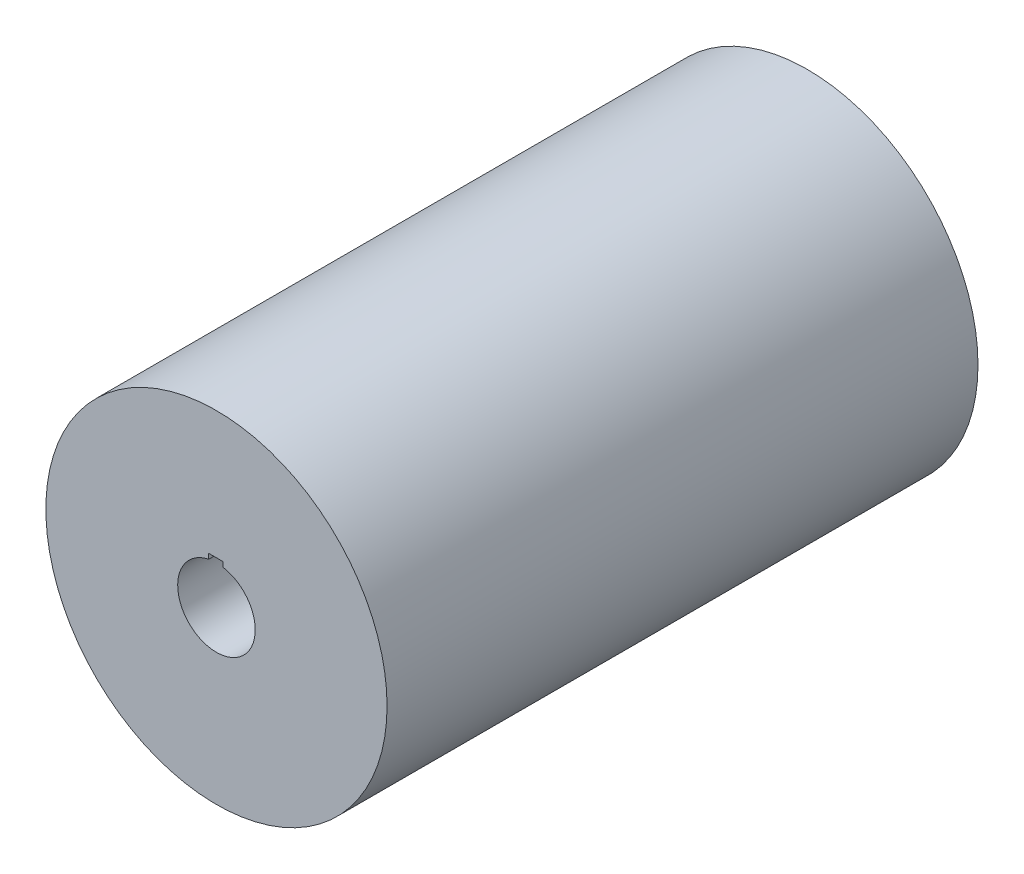
ISO-10303-21;
HEADER;
FILE_DESCRIPTION(('STEP AP214'),'2;1');
FILE_NAME('part.step','',(''),(''),'','','');
FILE_SCHEMA(('AUTOMOTIVE_DESIGN { 1 0 10303 214 1 1 1 1 }'));
ENDSEC;
DATA;
#1=APPLICATION_CONTEXT('core data for automotive mechanical design processes');
#2=APPLICATION_PROTOCOL_DEFINITION('international standard','automotive_design',2000,#1);
#3=PRODUCT_CONTEXT('',#1,'mechanical');
#4=PRODUCT('Part','Part','',(#3));
#5=PRODUCT_RELATED_PRODUCT_CATEGORY('part','',(#4));
#6=PRODUCT_DEFINITION_FORMATION('','',#4);
#7=PRODUCT_DEFINITION_CONTEXT('part definition',#1,'design');
#8=PRODUCT_DEFINITION('design','',#6,#7);
#9=PRODUCT_DEFINITION_SHAPE('','',#8);
#10=(LENGTH_UNIT() NAMED_UNIT(*) SI_UNIT(.MILLI.,.METRE.));
#11=(NAMED_UNIT(*) PLANE_ANGLE_UNIT() SI_UNIT($,.RADIAN.));
#12=(NAMED_UNIT(*) SI_UNIT($,.STERADIAN.) SOLID_ANGLE_UNIT());
#13=UNCERTAINTY_MEASURE_WITH_UNIT(LENGTH_MEASURE(1.E-05),#10,'distance_accuracy_value','');
#14=(GEOMETRIC_REPRESENTATION_CONTEXT(3) GLOBAL_UNCERTAINTY_ASSIGNED_CONTEXT((#13)) GLOBAL_UNIT_ASSIGNED_CONTEXT((#10,
#11,#12)) REPRESENTATION_CONTEXT('',''));
#15=CARTESIAN_POINT('',(0.,0.,0.));
#16=DIRECTION('',(0.,0.,1.));
#17=DIRECTION('',(1.,0.,0.));
#18=AXIS2_PLACEMENT_3D('',#15,#16,#17);
#19=CARTESIAN_POINT('',(0.,0.,50.8));
#20=DIRECTION('',(0.,0.,-1.));
#21=DIRECTION('',(-1.,0.,0.));
#22=AXIS2_PLACEMENT_3D('',#19,#20,#21);
#23=CYLINDRICAL_SURFACE('',#22,11.);
#24=CARTESIAN_POINT('',(0.,0.,12.7));
#25=DIRECTION('',(0.,0.,1.));
#26=DIRECTION('',(1.,0.,0.));
#27=AXIS2_PLACEMENT_3D('',#24,#25,#26);
#28=CIRCLE('',#27,11.);
#29=CARTESIAN_POINT('',(11.,0.,12.7));
#30=VERTEX_POINT('',#29);
#31=EDGE_CURVE('E226',#30,#30,#28,.T.);
#32=ORIENTED_EDGE('',*,*,#31,.T.);
#33=EDGE_LOOP('',(#32));
#34=FACE_BOUND('',#33,.T.);
#35=CARTESIAN_POINT('',(0.,-11.,42.6815604588032));
#36=CARTESIAN_POINT('',(0.17447784882036,-10.9999980315971,42.6815575656811));
#37=CARTESIAN_POINT('',(0.348985296611114,-10.9958086419645,42.667130269524));
#38=CARTESIAN_POINT('',(0.692937523118161,-10.9795047089388,42.6099268589009));
#39=CARTESIAN_POINT('',(0.862380444771043,-10.9673872948852,42.5671404758121));
#40=CARTESIAN_POINT('',(1.19119170201237,-10.93655850108,42.4547524865095));
#41=CARTESIAN_POINT('',(1.35057388190038,-10.9178564263374,42.3851887074722));
#42=CARTESIAN_POINT('',(1.65541144724201,-10.8758135769035,42.2213705269558));
#43=CARTESIAN_POINT('',(1.8008652920113,-10.8524722899215,42.1271133983172));
#44=CARTESIAN_POINT('',(2.0776123663672,-10.80295251118,41.9139224262729));
#45=CARTESIAN_POINT('',(2.20847972910201,-10.7767191903409,41.7944485101898));
#46=CARTESIAN_POINT('',(2.44862695013,-10.7247076783817,41.5353675993764));
#47=CARTESIAN_POINT('',(2.55790349439264,-10.6989295576835,41.3957575195748));
#48=CARTESIAN_POINT('',(2.75394938582188,-10.650174042475,41.0968363136008));
#49=CARTESIAN_POINT('',(2.84020953762731,-10.6272651640779,40.9371790173192));
#50=CARTESIAN_POINT('',(2.98448667964161,-10.5876568016523,40.6048574751276));
#51=CARTESIAN_POINT('',(3.04250988628328,-10.5709559511025,40.4321961017717));
#52=CARTESIAN_POINT('',(3.12715034714241,-10.5462240912952,40.0835276400736));
#53=CARTESIAN_POINT('',(3.15454826954992,-10.5379780388904,39.907725710851));
#54=CARTESIAN_POINT('',(3.17959692368801,-10.5304486860519,39.5538421684694));
#55=CARTESIAN_POINT('',(3.17725426651472,-10.5311633937115,39.375761070744));
#56=CARTESIAN_POINT('',(3.14350374872841,-10.5412835501104,39.0286303058009));
#57=CARTESIAN_POINT('',(3.11306181582723,-10.550400162677,38.8594769289684));
#58=CARTESIAN_POINT('',(3.02553270427924,-10.5758313370651,38.5287878967923));
#59=CARTESIAN_POINT('',(2.96844307248755,-10.5921465615717,38.3672529442965));
#60=CARTESIAN_POINT('',(2.82850138546198,-10.6303753213086,38.0539690684149));
#61=CARTESIAN_POINT('',(2.74532719879953,-10.6523582097638,37.9023728618308));
#62=CARTESIAN_POINT('',(2.55580154530478,-10.6994106638876,37.6149600123187));
#63=CARTESIAN_POINT('',(2.44944482568637,-10.7244809285447,37.4791469563069));
#64=CARTESIAN_POINT('',(2.21172581350605,-10.7760657372918,37.2216623382329));
#65=CARTESIAN_POINT('',(2.07955843927191,-10.8025987253252,37.1007365535988));
#66=CARTESIAN_POINT('',(1.7964913509913,-10.853260482362,36.8825992768039));
#67=CARTESIAN_POINT('',(1.64559062670365,-10.8773891215785,36.7853890644016));
#68=CARTESIAN_POINT('',(1.32805611310651,-10.9207168861609,36.617034390285));
#69=CARTESIAN_POINT('',(1.16133605771218,-10.9398865748984,36.5460445563074));
#70=CARTESIAN_POINT('',(0.817643733250416,-10.970924432868,36.433326366705));
#71=CARTESIAN_POINT('',(0.640674116129169,-10.9827944816379,36.3915904782807));
#72=CARTESIAN_POINT('',(0.287854792866045,-10.9976029144195,36.3397814417952));
#73=CARTESIAN_POINT('',(0.112165415352634,-11.0008266125237,36.3286964718568));
#74=CARTESIAN_POINT('',(-0.238569352848221,-10.9988102491892,36.3356826769815));
#75=CARTESIAN_POINT('',(-0.413614819898147,-10.9935712260693,36.3537502752206));
#76=CARTESIAN_POINT('',(-0.754347232215775,-10.9754040798234,36.4177060260621));
#77=CARTESIAN_POINT('',(-0.920152754142821,-10.9626368464645,36.4630124285352));
#78=CARTESIAN_POINT('',(-1.241780904537,-10.9308791540561,36.5794684180375));
#79=CARTESIAN_POINT('',(-1.39760236606275,-10.9118879691288,36.6506210195234));
#80=CARTESIAN_POINT('',(-1.698636240984,-10.8691431894916,36.8185103029531));
#81=CARTESIAN_POINT('',(-1.84354059271255,-10.8452941833473,36.9157744256937));
#82=CARTESIAN_POINT('',(-2.11531962144669,-10.7955797782755,37.1324773283788));
#83=CARTESIAN_POINT('',(-2.24219010017519,-10.769713911987,37.2519212568937));
#84=CARTESIAN_POINT('',(-2.47868959766384,-10.7178013554388,37.5143386940007));
#85=CARTESIAN_POINT('',(-2.58760041901602,-10.6917775287883,37.6579653278818));
#86=CARTESIAN_POINT('',(-2.779812504026,-10.6434252712996,37.9620186172471));
#87=CARTESIAN_POINT('',(-2.86311462038128,-10.6210967174307,38.1224447131182));
#88=CARTESIAN_POINT('',(-3.00114332068901,-10.582923622818,38.4549053185694));
#89=CARTESIAN_POINT('',(-3.05601817781999,-10.567045532883,38.6268741993535));
#90=CARTESIAN_POINT('',(-3.13589248945074,-10.5436210190611,38.9781478928741));
#91=CARTESIAN_POINT('',(-3.16090123016605,-10.5360720054857,39.1574504074348));
#92=CARTESIAN_POINT('',(-3.17973495731541,-10.5304021562534,39.5108802626274));
#93=CARTESIAN_POINT('',(-3.1747245750257,-10.5319291848155,39.6849407438746));
#94=CARTESIAN_POINT('',(-3.13641460445321,-10.5434005221629,40.0296231559947));
#95=CARTESIAN_POINT('',(-3.10311599678252,-10.553344539173,40.2002452058512));
#96=CARTESIAN_POINT('',(-3.00990083329036,-10.5803022392745,40.5314589500593));
#97=CARTESIAN_POINT('',(-2.95027089422422,-10.5972396733982,40.6921379651415));
#98=CARTESIAN_POINT('',(-2.80630762342209,-10.6362669560965,41.0013381108017));
#99=CARTESIAN_POINT('',(-2.72196984550124,-10.6583577318709,41.149857047009));
#100=CARTESIAN_POINT('',(-2.5276231791783,-10.7061404454788,41.435980827675));
#101=CARTESIAN_POINT('',(-2.4168389036018,-10.731929292612,41.5730428377801));
#102=CARTESIAN_POINT('',(-2.17416738015881,-10.7837083063394,41.827008818594));
#103=CARTESIAN_POINT('',(-2.04227479339959,-10.8096985222787,41.9439076738836));
#104=CARTESIAN_POINT('',(-1.75693999431164,-10.8597726207822,42.1572863698102));
#105=CARTESIAN_POINT('',(-1.60302138924242,-10.883788195325,42.2531467560879));
#106=CARTESIAN_POINT('',(-1.28055928911018,-10.9264149803965,42.4174879712137));
#107=CARTESIAN_POINT('',(-1.11202361610921,-10.9450290585434,42.4859833352733));
#108=CARTESIAN_POINT('',(-0.787202865035639,-10.9728498912777,42.5865075411475));
#109=CARTESIAN_POINT('',(-0.632077060056496,-10.9829506569497,42.6220608624997));
#110=CARTESIAN_POINT('',(-0.317975335242661,-10.9965261441504,42.6695869881041));
#111=CARTESIAN_POINT('',(-0.15899995785191,-11.0000017937863,42.6815630952771));
#112=CARTESIAN_POINT('',(0.,-11.,42.6815604588032));
#113=B_SPLINE_CURVE_WITH_KNOTS('',3,(#35,#36,#37,#38,#39,#40,#41,#42,#43,#44,#45,#46,#47,#48,
#49,#50,#51,#52,#53,#54,#55,#56,#57,#58,#59,#60,#61,#62,#63,#64,#65,#66,#67,#68,#69,#70,#71,#72,
#73,#74,#75,#76,#77,#78,#79,#80,#81,#82,#83,#84,#85,#86,#87,#88,#89,#90,#91,#92,#93,#94,#95,#96,
#97,#98,#99,#100,#101,#102,#103,#104,#105,#106,#107,#108,#109,#110,#111,#112),.UNSPECIFIED.,.T.,
.F.,(4,2,2,2,2,2,2,2,2,2,2,2,2,2,2,2,2,2,2,2,2,2,2,2,2,2,2,2,2,2,2,2,2,2,2,2,2,2,4),(0.,
0.522849842782911,1.04588910926093,1.56819219820975,2.09055299519557,2.62550552412474,
3.16054010061979,3.70658003500084,4.25249970290628,4.78416127082409,5.31570465664107,
5.82963025664875,6.3436031771655,6.86419146209175,7.38489782672938,7.92565183110965,
8.46643500963484,9.01035823514409,9.55414135061991,10.0797461914809,10.6052865490665,
11.1199827539484,11.634739007424,12.1607976381826,12.6869785352694,13.2307502612654,
13.7745038792386,14.3153920400297,14.8561119796568,15.3759933923317,15.8958567840387,
16.4101958290127,16.9246274864016,17.4565514687622,17.9886102030832,18.5346936455598,
19.0804866433583,19.5570213557321,20.0334893058325),.UNSPECIFIED.);
#114=CARTESIAN_POINT('',(0.,-11.,42.6815604588032));
#115=VERTEX_POINT('',#114);
#116=EDGE_CURVE('E107',#115,#115,#113,.T.);
#117=ORIENTED_EDGE('',*,*,#116,.T.);
#118=EDGE_LOOP('',(#117));
#119=FACE_BOUND('',#118,.T.);
#120=CARTESIAN_POINT('',(0.,0.,50.8));
#121=DIRECTION('',(0.,0.,1.));
#122=DIRECTION('',(1.,0.,0.));
#123=AXIS2_PLACEMENT_3D('',#120,#121,#122);
#124=CIRCLE('',#123,11.);
#125=CARTESIAN_POINT('',(11.,0.,50.8));
#126=VERTEX_POINT('',#125);
#127=EDGE_CURVE('E185',#126,#126,#124,.T.);
#128=ORIENTED_EDGE('',*,*,#127,.F.);
#129=EDGE_LOOP('',(#128));
#130=FACE_BOUND('',#129,.T.);
#131=ADVANCED_FACE('F38',(#34,#119,#130),#23,.T.);
#132=CARTESIAN_POINT('',(0.,0.,50.8));
#133=DIRECTION('',(0.,0.,1.));
#134=DIRECTION('',(1.,0.,0.));
#135=AXIS2_PLACEMENT_3D('',#132,#133,#134);
#136=PLANE('',#135);
#137=DIRECTION('',(0.,-1.,0.));
#138=VECTOR('',#137,1.);
#139=CARTESIAN_POINT('',(-0.5,2.78020951222945,50.8));
#140=LINE('',#139,#138);
#141=CARTESIAN_POINT('',(-0.5,2.78020951222945,50.8));
#142=VERTEX_POINT('',#141);
#143=CARTESIAN_POINT('',(-0.5,2.44948974278318,50.8));
#144=VERTEX_POINT('',#143);
#145=EDGE_CURVE('E146',#142,#144,#140,.T.);
#146=ORIENTED_EDGE('',*,*,#145,.F.);
#147=DIRECTION('',(1.,0.,0.));
#148=VECTOR('',#147,1.);
#149=CARTESIAN_POINT('',(-0.5,2.78020951222945,50.8));
#150=LINE('',#149,#148);
#151=CARTESIAN_POINT('',(0.429150012935397,2.78020951222945,50.8));
#152=VERTEX_POINT('',#151);
#153=EDGE_CURVE('E152',#142,#152,#150,.T.);
#154=ORIENTED_EDGE('',*,*,#153,.T.);
#155=DIRECTION('',(0.,-1.,0.));
#156=VECTOR('',#155,1.);
#157=CARTESIAN_POINT('',(0.429150012935397,2.78020951222945,50.8));
#158=LINE('',#157,#156);
#159=CARTESIAN_POINT('',(0.429150012935397,2.46289063224447,50.8));
#160=VERTEX_POINT('',#159);
#161=EDGE_CURVE('E161',#152,#160,#158,.T.);
#162=ORIENTED_EDGE('',*,*,#161,.T.);
#163=CARTESIAN_POINT('',(0.,0.,50.8));
#164=DIRECTION('',(0.,0.,1.));
#165=DIRECTION('',(1.,0.,0.));
#166=AXIS2_PLACEMENT_3D('',#163,#164,#165);
#167=CIRCLE('',#166,2.5);
#168=EDGE_CURVE('E171',#144,#160,#167,.T.);
#169=ORIENTED_EDGE('',*,*,#168,.F.);
#170=EDGE_LOOP('',(#146,#154,#162,#169));
#171=FACE_BOUND('',#170,.T.);
#172=ORIENTED_EDGE('',*,*,#127,.T.);
#173=EDGE_LOOP('',(#172));
#174=FACE_BOUND('',#173,.T.);
#175=ADVANCED_FACE('F200',(#171,#174),#136,.T.);
#176=CARTESIAN_POINT('',(0.,0.,25.4));
#177=DIRECTION('',(0.,0.,-1.));
#178=DIRECTION('',(-1.,0.,0.));
#179=AXIS2_PLACEMENT_3D('',#176,#177,#178);
#180=CYLINDRICAL_SURFACE('',#179,5.);
#181=CARTESIAN_POINT('',(0.,0.,12.7));
#182=DIRECTION('',(0.,0.,1.));
#183=DIRECTION('',(1.,0.,0.));
#184=AXIS2_PLACEMENT_3D('',#181,#182,#183);
#185=CIRCLE('',#184,5.);
#186=CARTESIAN_POINT('',(5.,0.,12.7));
#187=VERTEX_POINT('',#186);
#188=EDGE_CURVE('E42',#187,#187,#185,.T.);
#189=ORIENTED_EDGE('',*,*,#188,.F.);
#190=EDGE_LOOP('',(#189));
#191=FACE_BOUND('',#190,.T.);
#192=CARTESIAN_POINT('',(0.,0.,25.4));
#193=DIRECTION('',(0.,0.,1.));
#194=DIRECTION('',(1.,0.,0.));
#195=AXIS2_PLACEMENT_3D('',#192,#193,#194);
#196=CIRCLE('',#195,5.);
#197=CARTESIAN_POINT('',(5.,0.,25.4));
#198=VERTEX_POINT('',#197);
#199=EDGE_CURVE('E178',#198,#198,#196,.T.);
#200=ORIENTED_EDGE('',*,*,#199,.T.);
#201=EDGE_LOOP('',(#200));
#202=FACE_BOUND('',#201,.T.);
#203=ADVANCED_FACE('F222',(#191,#202),#180,.F.);
#204=CARTESIAN_POINT('',(0.,0.,25.4));
#205=DIRECTION('',(0.,0.,1.));
#206=DIRECTION('',(1.,0.,0.));
#207=AXIS2_PLACEMENT_3D('',#204,#205,#206);
#208=PLANE('',#207);
#209=DIRECTION('',(1.,0.,0.));
#210=VECTOR('',#209,1.);
#211=CARTESIAN_POINT('',(-0.5,2.78020951222945,25.4));
#212=LINE('',#211,#210);
#213=CARTESIAN_POINT('',(-0.5,2.78020951222945,25.4));
#214=VERTEX_POINT('',#213);
#215=CARTESIAN_POINT('',(0.429150012935397,2.78020951222945,25.4));
#216=VERTEX_POINT('',#215);
#217=EDGE_CURVE('E155',#214,#216,#212,.T.);
#218=ORIENTED_EDGE('',*,*,#217,.F.);
#219=DIRECTION('',(0.,-1.,0.));
#220=VECTOR('',#219,1.);
#221=CARTESIAN_POINT('',(-0.5,2.78020951222945,25.4));
#222=LINE('',#221,#220);
#223=CARTESIAN_POINT('',(-0.5,2.44948974278318,25.4));
#224=VERTEX_POINT('',#223);
#225=EDGE_CURVE('E148',#214,#224,#222,.T.);
#226=ORIENTED_EDGE('',*,*,#225,.T.);
#227=CARTESIAN_POINT('',(0.,0.,25.4));
#228=DIRECTION('',(0.,0.,1.));
#229=DIRECTION('',(1.,0.,0.));
#230=AXIS2_PLACEMENT_3D('',#227,#228,#229);
#231=CIRCLE('',#230,2.5);
#232=CARTESIAN_POINT('',(0.429150012935397,2.46289063224447,25.4));
#233=VERTEX_POINT('',#232);
#234=EDGE_CURVE('E174',#224,#233,#231,.T.);
#235=ORIENTED_EDGE('',*,*,#234,.T.);
#236=DIRECTION('',(0.,-1.,0.));
#237=VECTOR('',#236,1.);
#238=CARTESIAN_POINT('',(0.429150012935397,2.78020951222945,25.4));
#239=LINE('',#238,#237);
#240=EDGE_CURVE('E62',#216,#233,#239,.T.);
#241=ORIENTED_EDGE('',*,*,#240,.F.);
#242=EDGE_LOOP('',(#218,#226,#235,#241));
#243=FACE_BOUND('',#242,.T.);
#244=ORIENTED_EDGE('',*,*,#199,.F.);
#245=EDGE_LOOP('',(#244));
#246=FACE_BOUND('',#245,.T.);
#247=ADVANCED_FACE('F207',(#243,#246),#208,.F.);
#248=CARTESIAN_POINT('',(0.,0.,25.4));
#249=DIRECTION('',(0.,0.,1.));
#250=DIRECTION('',(1.,0.,0.));
#251=AXIS2_PLACEMENT_3D('',#248,#249,#250);
#252=CYLINDRICAL_SURFACE('',#251,2.5);
#253=CARTESIAN_POINT('',(2.5,0.,41.4637587114082));
#254=CARTESIAN_POINT('',(2.50001095177646,-0.0483908730512587,41.463729243075));
#255=CARTESIAN_POINT('',(2.4985954686324,-0.0967635234678165,41.4655526142861));
#256=CARTESIAN_POINT('',(2.49300031524189,-0.193014985957058,41.4726761335237));
#257=CARTESIAN_POINT('',(2.48882512774837,-0.240894471227123,41.4779706430593));
#258=CARTESIAN_POINT('',(2.47786945737588,-0.335252351070256,41.4917201334698));
#259=CARTESIAN_POINT('',(2.47112308335948,-0.381740839970777,41.5001336992607));
#260=CARTESIAN_POINT('',(2.45515609375413,-0.473696750606339,41.519765660189));
#261=CARTESIAN_POINT('',(2.44593430191665,-0.519163675763782,41.530985388562));
#262=CARTESIAN_POINT('',(2.4076592356589,-0.684424677517972,41.5767492119193));
#263=CARTESIAN_POINT('',(2.37134907026899,-0.800534718171201,41.6187699141995));
#264=CARTESIAN_POINT('',(2.28409602761612,-1.02342598835804,41.7128381171083));
#265=CARTESIAN_POINT('',(2.23305068668041,-1.13013481765496,41.7649549581354));
#266=CARTESIAN_POINT('',(2.13696989097109,-1.29977566299991,41.8553448340557));
#267=CARTESIAN_POINT('',(2.09559676941051,-1.3654493441476,41.8924462423511));
#268=CARTESIAN_POINT('',(2.00714738579708,-1.49243280934942,41.9673220116541));
#269=CARTESIAN_POINT('',(1.96006924588934,-1.55374114591402,42.0050965907328));
#270=CARTESIAN_POINT('',(1.81060838932857,-1.73075502377953,42.1176526078712));
#271=CARTESIAN_POINT('',(1.69977934027794,-1.83993624018912,42.1918847602206));
#272=CARTESIAN_POINT('',(1.47979164567611,-2.01898032492359,42.3179192827941));
#273=CARTESIAN_POINT('',(1.37438189365787,-2.09236846374418,42.3712940443104));
#274=CARTESIAN_POINT('',(1.15018742086861,-2.22348022807807,42.4684082011757));
#275=CARTESIAN_POINT('',(1.03142115877075,-2.28122510506922,42.5121606531279));
#276=CARTESIAN_POINT('',(0.802232099896731,-2.37045818864128,42.5804857571437));
#277=CARTESIAN_POINT('',(0.693444886276972,-2.40465036620803,42.6069945485852));
#278=CARTESIAN_POINT('',(0.47013708051634,-2.45807284580685,42.6486080102013));
#279=CARTESIAN_POINT('',(0.355619737008753,-2.4773115255171,42.6637190658024));
#280=CARTESIAN_POINT('',(0.123659893884932,-2.49966457877044,42.6812887062803));
#281=CARTESIAN_POINT('',(0.00620917570775319,-2.50272692969069,42.6837064697309));
#282=CARTESIAN_POINT('',(-0.227504946230108,-2.49237348795664,42.6755572277553));
#283=CARTESIAN_POINT('',(-0.343768264020442,-2.47895651057274,42.6649892887629));
#284=CARTESIAN_POINT('',(-0.565850143703403,-2.43760998350453,42.6326463540632));
#285=CARTESIAN_POINT('',(-0.671900194734805,-2.41044080843065,42.6114590620313));
#286=CARTESIAN_POINT('',(-0.877480569931715,-2.34344384024387,42.5597394170646));
#287=CARTESIAN_POINT('',(-0.977009037725033,-2.30361246154535,42.5292044172085));
#288=CARTESIAN_POINT('',(-1.17758594160527,-2.20835306843212,42.4572173782339));
#289=CARTESIAN_POINT('',(-1.27779689790144,-2.15176612279123,42.4149805103461));
#290=CARTESIAN_POINT('',(-1.4675204835131,-2.02713714119475,42.3240230897793));
#291=CARTESIAN_POINT('',(-1.55702846997083,-1.9590901645791,42.2752997425492));
#292=CARTESIAN_POINT('',(-1.74207981782893,-1.79809036926464,42.1635727829672));
#293=CARTESIAN_POINT('',(-1.83512900663309,-1.70288864158126,42.0996837453619));
#294=CARTESIAN_POINT('',(-2.00495869782085,-1.49925541335049,41.970731547601));
#295=CARTESIAN_POINT('',(-2.08170577458398,-1.39079743576524,41.9056662663372));
#296=CARTESIAN_POINT('',(-2.20939364283949,-1.17566853652452,41.788170855644));
#297=CARTESIAN_POINT('',(-2.26237177552973,-1.07051103628511,41.7351841551006));
#298=CARTESIAN_POINT('',(-2.35381257763222,-0.850645715213797,41.6383658961011));
#299=CARTESIAN_POINT('',(-2.39236350876012,-0.736001385478731,41.5944794271971));
#300=CARTESIAN_POINT('',(-2.43509491866797,-0.56819072555111,41.5440376201387));
#301=CARTESIAN_POINT('',(-2.44612294384225,-0.518735855947478,41.5307486612398));
#302=CARTESIAN_POINT('',(-2.46524632545265,-0.41852179445991,41.5074128676513));
#303=CARTESIAN_POINT('',(-2.47334337042461,-0.367763371661705,41.4973641666169));
#304=CARTESIAN_POINT('',(-2.48651766187642,-0.264517325266093,41.4808896344953));
#305=CARTESIAN_POINT('',(-2.49155069022847,-0.212015408546747,41.4745169187677));
#306=CARTESIAN_POINT('',(-2.49830320582132,-0.106352616609378,41.4659259870745));
#307=CARTESIAN_POINT('',(-2.50001559041965,-0.0531905731409393,41.4637166766477));
#308=CARTESIAN_POINT('',(-2.50000000000001,0.,41.4637587114082));
#309=B_SPLINE_CURVE_WITH_KNOTS('',3,(#253,#254,#255,#256,#257,#258,#259,#260,#261,#262,#263,
#264,#265,#266,#267,#268,#269,#270,#271,#272,#273,#274,#275,#276,#277,#278,#279,#280,#281,#282,
#283,#284,#285,#286,#287,#288,#289,#290,#291,#292,#293,#294,#295,#296,#297,#298,#299,#300,#301,
#302,#303,#304,#305,#306,#307,#308),.UNSPECIFIED.,.F.,.F.,(4,2,2,2,2,2,2,2,2,2,2,2,2,2,2,2,2,2,
2,2,2,2,2,2,2,2,2,4),(0.,0.145088236663165,0.289941375097464,0.432936280084262,
0.575999252854037,0.959822788784016,1.34638239735148,1.60417265802422,1.86204800420095,
2.37632900615747,2.79206940196144,3.2072421466313,3.55697474264725,3.90651125990631,
4.25717119551713,4.60785634219916,4.94098061154614,5.27419929662042,5.6406344056606,
6.00722789888713,6.44861157212752,6.8908916981028,7.27715597928328,7.66101699489522,
7.81800644320321,7.9749053055073,8.13401785200906,8.29347035620483),.UNSPECIFIED.);
#310=CARTESIAN_POINT('',(2.5,0.,41.4637587114082));
#311=VERTEX_POINT('',#310);
#312=CARTESIAN_POINT('',(-2.5,0.,41.4637587114082));
#313=VERTEX_POINT('',#312);
#314=EDGE_CURVE('E98',#311,#313,#309,.T.);
#315=ORIENTED_EDGE('',*,*,#314,.T.);
#316=DIRECTION('',(0.,0.,1.));
#317=VECTOR('',#316,1.);
#318=CARTESIAN_POINT('',(-2.5,0.,25.4));
#319=LINE('',#318,#317);
#320=CARTESIAN_POINT('',(-2.5,0.,37.5493622061982));
#321=VERTEX_POINT('',#320);
#322=EDGE_CURVE('E11',#313,#321,#319,.F.);
#323=ORIENTED_EDGE('',*,*,#322,.T.);
#324=CARTESIAN_POINT('',(-2.5,0.,37.5493622061982));
#325=CARTESIAN_POINT('',(-2.50001095177646,-0.0483908730512586,37.5493916745314));
#326=CARTESIAN_POINT('',(-2.4985954686324,-0.0967635234678165,37.5475683033202));
#327=CARTESIAN_POINT('',(-2.49300031524189,-0.193014985957058,37.5404447840827));
#328=CARTESIAN_POINT('',(-2.48882512774837,-0.240894471227123,37.5351502745471));
#329=CARTESIAN_POINT('',(-2.47786945737588,-0.335252351070256,37.5214007841366));
#330=CARTESIAN_POINT('',(-2.47112308335948,-0.381740839970777,37.5129872183456));
#331=CARTESIAN_POINT('',(-2.45515609375413,-0.473696750606339,37.4933552574174));
#332=CARTESIAN_POINT('',(-2.44593430191665,-0.519163675763782,37.4821355290443));
#333=CARTESIAN_POINT('',(-2.4076592356589,-0.684424677517975,37.436371705687));
#334=CARTESIAN_POINT('',(-2.37134907026899,-0.800534718171207,37.3943510034069));
#335=CARTESIAN_POINT('',(-2.28409602761611,-1.02342598835804,37.3002828004981));
#336=CARTESIAN_POINT('',(-2.23305068668041,-1.13013481765497,37.248165959471));
#337=CARTESIAN_POINT('',(-2.13696989097109,-1.29977566299991,37.1577760835507));
#338=CARTESIAN_POINT('',(-2.09559676941051,-1.3654493441476,37.1206746752553));
#339=CARTESIAN_POINT('',(-2.00714738579708,-1.49243280934942,37.0457989059522));
#340=CARTESIAN_POINT('',(-1.96006924588934,-1.55374114591402,37.0080243268736));
#341=CARTESIAN_POINT('',(-1.81060838932857,-1.73075502377953,36.8954683097352));
#342=CARTESIAN_POINT('',(-1.69977934027794,-1.83993624018912,36.8212361573858));
#343=CARTESIAN_POINT('',(-1.47979164567611,-2.01898032492359,36.6952016348123));
#344=CARTESIAN_POINT('',(-1.37438189365787,-2.09236846374418,36.641826873296));
#345=CARTESIAN_POINT('',(-1.1501874208686,-2.22348022807807,36.5447127164307));
#346=CARTESIAN_POINT('',(-1.03142115877075,-2.28122510506922,36.5009602644785));
#347=CARTESIAN_POINT('',(-0.802232099896731,-2.37045818864128,36.4326351604626));
#348=CARTESIAN_POINT('',(-0.693444886276972,-2.40465036620803,36.4061263690212));
#349=CARTESIAN_POINT('',(-0.47013708051634,-2.45807284580685,36.3645129074051));
#350=CARTESIAN_POINT('',(-0.355619737008753,-2.4773115255171,36.349401851804));
#351=CARTESIAN_POINT('',(-0.123659893884932,-2.49966457877044,36.3318322113261));
#352=CARTESIAN_POINT('',(-0.0062091757077532,-2.50272692969069,36.3294144478755));
#353=CARTESIAN_POINT('',(0.227504946230108,-2.49237348795664,36.337563689851));
#354=CARTESIAN_POINT('',(0.343768264020442,-2.47895651057274,36.3481316288435));
#355=CARTESIAN_POINT('',(0.565850143703402,-2.43760998350453,36.3804745635431));
#356=CARTESIAN_POINT('',(0.671900194734804,-2.41044080843065,36.4016618555751));
#357=CARTESIAN_POINT('',(0.877480569931714,-2.34344384024387,36.4533815005418));
#358=CARTESIAN_POINT('',(0.977009037725033,-2.30361246154535,36.4839165003979));
#359=CARTESIAN_POINT('',(1.17758594160527,-2.20835306843212,36.5559035393724));
#360=CARTESIAN_POINT('',(1.27779689790144,-2.15176612279123,36.5981404072603));
#361=CARTESIAN_POINT('',(1.4675204835131,-2.02713714119475,36.6890978278271));
#362=CARTESIAN_POINT('',(1.55702846997083,-1.9590901645791,36.7378211750572));
#363=CARTESIAN_POINT('',(1.74207981782893,-1.79809036926464,36.8495481346392));
#364=CARTESIAN_POINT('',(1.83512900663309,-1.70288864158126,36.9134371722445));
#365=CARTESIAN_POINT('',(2.00495869782085,-1.49925541335049,37.0423893700054));
#366=CARTESIAN_POINT('',(2.08170577458398,-1.39079743576524,37.1074546512692));
#367=CARTESIAN_POINT('',(2.20939364283949,-1.17566853652452,37.2249500619623));
#368=CARTESIAN_POINT('',(2.26237177552973,-1.07051103628511,37.2779367625058));
#369=CARTESIAN_POINT('',(2.35381257763222,-0.850645715213799,37.3747550215053));
#370=CARTESIAN_POINT('',(2.39236350876012,-0.736001385478732,37.4186414904093));
#371=CARTESIAN_POINT('',(2.43509491866797,-0.56819072555111,37.4690832974677));
#372=CARTESIAN_POINT('',(2.44612294384225,-0.518735855947479,37.4823722563666));
#373=CARTESIAN_POINT('',(2.46524632545265,-0.418521794459911,37.505708049955));
#374=CARTESIAN_POINT('',(2.47334337042461,-0.367763371661705,37.5157567509895));
#375=CARTESIAN_POINT('',(2.48651766187642,-0.264517325266093,37.532231283111));
#376=CARTESIAN_POINT('',(2.49155069022847,-0.212015408546747,37.5386039988386));
#377=CARTESIAN_POINT('',(2.49830320582132,-0.106352616609379,37.5471949305319));
#378=CARTESIAN_POINT('',(2.50001559041965,-0.0531905731409393,37.5494042409586));
#379=CARTESIAN_POINT('',(2.50000000000001,0.,37.5493622061982));
#380=B_SPLINE_CURVE_WITH_KNOTS('',3,(#324,#325,#326,#327,#328,#329,#330,#331,#332,#333,#334,
#335,#336,#337,#338,#339,#340,#341,#342,#343,#344,#345,#346,#347,#348,#349,#350,#351,#352,#353,
#354,#355,#356,#357,#358,#359,#360,#361,#362,#363,#364,#365,#366,#367,#368,#369,#370,#371,#372,
#373,#374,#375,#376,#377,#378,#379),.UNSPECIFIED.,.F.,.F.,(4,2,2,2,2,2,2,2,2,2,2,2,2,2,2,2,2,2,
2,2,2,2,2,2,2,2,2,4),(0.,0.145088236663165,0.289941375097464,0.432936280084262,
0.575999252854037,0.959822788784027,1.34638239735148,1.60417265802422,1.86204800420095,
2.37632900615747,2.79206940196145,3.2072421466313,3.55697474264725,3.90651125990631,
4.25717119551713,4.60785634219916,4.94098061154613,5.27419929662042,5.6406344056606,
6.00722789888713,6.44861157212752,6.89089169810281,7.27715597928328,7.66101699489522,
7.81800644320321,7.9749053055073,8.13401785200906,8.29347035620483),.UNSPECIFIED.);
#381=CARTESIAN_POINT('',(2.5,0.,37.5493622061982));
#382=VERTEX_POINT('',#381);
#383=EDGE_CURVE('E48',#321,#382,#380,.T.);
#384=ORIENTED_EDGE('',*,*,#383,.T.);
#385=DIRECTION('',(0.,0.,1.));
#386=VECTOR('',#385,1.);
#387=CARTESIAN_POINT('',(2.5,0.,25.4));
#388=LINE('',#387,#386);
#389=EDGE_CURVE('E92',#382,#311,#388,.T.);
#390=ORIENTED_EDGE('',*,*,#389,.T.);
#391=EDGE_LOOP('',(#315,#323,#384,#390));
#392=FACE_BOUND('',#391,.T.);
#393=ORIENTED_EDGE('',*,*,#234,.F.);
#394=DIRECTION('',(0.,0.,1.));
#395=VECTOR('',#394,1.);
#396=CARTESIAN_POINT('',(-0.5,2.44948974278318,25.4));
#397=LINE('',#396,#395);
#398=EDGE_CURVE('E99',#224,#144,#397,.T.);
#399=ORIENTED_EDGE('',*,*,#398,.T.);
#400=ORIENTED_EDGE('',*,*,#168,.T.);
#401=DIRECTION('',(0.,0.,1.));
#402=VECTOR('',#401,1.);
#403=CARTESIAN_POINT('',(0.429150012935397,2.46289063224447,25.4));
#404=LINE('',#403,#402);
#405=EDGE_CURVE('E189',#233,#160,#404,.T.);
#406=ORIENTED_EDGE('',*,*,#405,.F.);
#407=EDGE_LOOP('',(#393,#399,#400,#406));
#408=FACE_BOUND('',#407,.T.);
#409=ADVANCED_FACE('F110',(#392,#408),#252,.F.);
#410=CARTESIAN_POINT('',(-0.5,2.78020951222945,25.4));
#411=DIRECTION('',(-1.,0.,0.));
#412=DIRECTION('',(0.,-1.,0.));
#413=AXIS2_PLACEMENT_3D('',#410,#411,#412);
#414=PLANE('',#413);
#415=ORIENTED_EDGE('',*,*,#225,.F.);
#416=DIRECTION('',(0.,0.,1.));
#417=VECTOR('',#416,1.);
#418=CARTESIAN_POINT('',(-0.5,2.78020951222945,25.4));
#419=LINE('',#418,#417);
#420=EDGE_CURVE('E168',#214,#142,#419,.T.);
#421=ORIENTED_EDGE('',*,*,#420,.T.);
#422=ORIENTED_EDGE('',*,*,#145,.T.);
#423=ORIENTED_EDGE('',*,*,#398,.F.);
#424=EDGE_LOOP('',(#415,#421,#422,#423));
#425=FACE_BOUND('',#424,.T.);
#426=ADVANCED_FACE('F209',(#425),#414,.F.);
#427=CARTESIAN_POINT('',(0.429150012935397,2.78020951222945,25.4));
#428=DIRECTION('',(-1.,0.,0.));
#429=DIRECTION('',(0.,0.,1.));
#430=AXIS2_PLACEMENT_3D('',#427,#428,#429);
#431=PLANE('',#430);
#432=ORIENTED_EDGE('',*,*,#405,.T.);
#433=ORIENTED_EDGE('',*,*,#161,.F.);
#434=DIRECTION('',(0.,0.,1.));
#435=VECTOR('',#434,1.);
#436=CARTESIAN_POINT('',(0.429150012935397,2.78020951222945,25.4));
#437=LINE('',#436,#435);
#438=EDGE_CURVE('E158',#216,#152,#437,.T.);
#439=ORIENTED_EDGE('',*,*,#438,.F.);
#440=ORIENTED_EDGE('',*,*,#240,.T.);
#441=EDGE_LOOP('',(#432,#433,#439,#440));
#442=FACE_BOUND('',#441,.T.);
#443=ADVANCED_FACE('F204',(#442),#431,.T.);
#444=CARTESIAN_POINT('',(-0.5,2.78020951222945,25.4));
#445=DIRECTION('',(0.,-1.,0.));
#446=DIRECTION('',(0.,0.,-1.));
#447=AXIS2_PLACEMENT_3D('',#444,#445,#446);
#448=PLANE('',#447);
#449=ORIENTED_EDGE('',*,*,#153,.F.);
#450=ORIENTED_EDGE('',*,*,#420,.F.);
#451=ORIENTED_EDGE('',*,*,#217,.T.);
#452=ORIENTED_EDGE('',*,*,#438,.T.);
#453=EDGE_LOOP('',(#449,#450,#451,#452));
#454=FACE_BOUND('',#453,.T.);
#455=ADVANCED_FACE('F134',(#454),#448,.T.);
#456=CARTESIAN_POINT('',(0.,-12.,39.5065604588032));
#457=DIRECTION('',(0.,1.,0.));
#458=DIRECTION('',(0.,0.,1.));
#459=AXIS2_PLACEMENT_3D('',#456,#457,#458);
#460=CYLINDRICAL_SURFACE('',#459,3.175);
#461=CARTESIAN_POINT('',(0.,0.,39.5065604588032));
#462=DIRECTION('',(0.,1.,0.));
#463=DIRECTION('',(0.,0.,1.));
#464=AXIS2_PLACEMENT_3D('',#461,#462,#463);
#465=CIRCLE('',#464,3.175);
#466=EDGE_CURVE('E108',#321,#313,#465,.T.);
#467=ORIENTED_EDGE('',*,*,#466,.T.);
#468=ORIENTED_EDGE('',*,*,#314,.F.);
#469=EDGE_CURVE('E54',#311,#382,#465,.T.);
#470=ORIENTED_EDGE('',*,*,#469,.T.);
#471=ORIENTED_EDGE('',*,*,#383,.F.);
#472=EDGE_LOOP('',(#467,#468,#470,#471));
#473=FACE_BOUND('',#472,.T.);
#474=ORIENTED_EDGE('',*,*,#116,.F.);
#475=EDGE_LOOP('',(#474));
#476=FACE_BOUND('',#475,.T.);
#477=ADVANCED_FACE('F103',(#473,#476),#460,.F.);
#478=CARTESIAN_POINT('',(0.,0.,39.5065604588032));
#479=DIRECTION('',(0.,1.,0.));
#480=DIRECTION('',(0.,0.,1.));
#481=AXIS2_PLACEMENT_3D('',#478,#479,#480);
#482=PLANE('',#481);
#483=ORIENTED_EDGE('',*,*,#466,.F.);
#484=ORIENTED_EDGE('',*,*,#322,.F.);
#485=EDGE_LOOP('',(#483,#484));
#486=FACE_BOUND('',#485,.T.);
#487=ADVANCED_FACE('F133',(#486),#482,.F.);
#488=ORIENTED_EDGE('',*,*,#469,.F.);
#489=ORIENTED_EDGE('',*,*,#389,.F.);
#490=EDGE_LOOP('',(#488,#489));
#491=FACE_BOUND('',#490,.T.);
#492=ADVANCED_FACE('F93',(#491),#482,.F.);
#493=CARTESIAN_POINT('',(0.,0.,12.7));
#494=DIRECTION('',(0.,0.,1.));
#495=DIRECTION('',(1.,0.,0.));
#496=AXIS2_PLACEMENT_3D('',#493,#494,#495);
#497=PLANE('',#496);
#498=ORIENTED_EDGE('',*,*,#188,.T.);
#499=EDGE_LOOP('',(#498));
#500=FACE_BOUND('',#499,.T.);
#501=ORIENTED_EDGE('',*,*,#31,.F.);
#502=EDGE_LOOP('',(#501));
#503=FACE_BOUND('',#502,.T.);
#504=ADVANCED_FACE('F242',(#500,#503),#497,.F.);
#505=CLOSED_SHELL('',(#131,#175,#203,#247,#409,#426,#443,#455,#477,#487,#492,#504));
#506=MANIFOLD_SOLID_BREP('B2',#505);
#507=ADVANCED_BREP_SHAPE_REPRESENTATION('',(#18,#506),#14);
#508=SHAPE_DEFINITION_REPRESENTATION(#9,#507);
ENDSEC;
END-ISO-10303-21;
